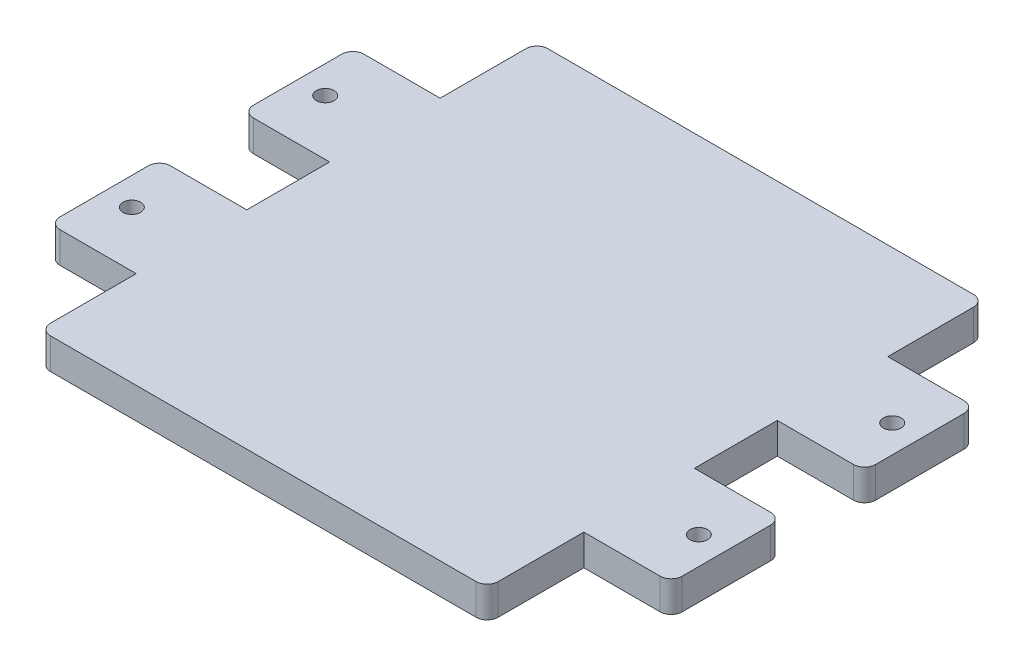
ISO-10303-21;
HEADER;
FILE_DESCRIPTION(('STEP AP214'),'2;1');
FILE_NAME('part.step','',(''),(''),'','','');
FILE_SCHEMA(('AUTOMOTIVE_DESIGN { 1 0 10303 214 1 1 1 1 }'));
ENDSEC;
DATA;
#1=APPLICATION_CONTEXT('core data for automotive mechanical design processes');
#2=APPLICATION_PROTOCOL_DEFINITION('international standard','automotive_design',2000,#1);
#3=PRODUCT_CONTEXT('',#1,'mechanical');
#4=PRODUCT('Part','Part','',(#3));
#5=PRODUCT_RELATED_PRODUCT_CATEGORY('part','',(#4));
#6=PRODUCT_DEFINITION_FORMATION('','',#4);
#7=PRODUCT_DEFINITION_CONTEXT('part definition',#1,'design');
#8=PRODUCT_DEFINITION('design','',#6,#7);
#9=PRODUCT_DEFINITION_SHAPE('','',#8);
#10=(LENGTH_UNIT() NAMED_UNIT(*) SI_UNIT(.MILLI.,.METRE.));
#11=(NAMED_UNIT(*) PLANE_ANGLE_UNIT() SI_UNIT($,.RADIAN.));
#12=(NAMED_UNIT(*) SI_UNIT($,.STERADIAN.) SOLID_ANGLE_UNIT());
#13=UNCERTAINTY_MEASURE_WITH_UNIT(LENGTH_MEASURE(1.E-05),#10,'distance_accuracy_value','');
#14=(GEOMETRIC_REPRESENTATION_CONTEXT(3) GLOBAL_UNCERTAINTY_ASSIGNED_CONTEXT((#13)) GLOBAL_UNIT_ASSIGNED_CONTEXT((#10,
#11,#12)) REPRESENTATION_CONTEXT('',''));
#15=CARTESIAN_POINT('',(0.,0.,0.));
#16=DIRECTION('',(0.,0.,1.));
#17=DIRECTION('',(1.,0.,0.));
#18=AXIS2_PLACEMENT_3D('',#15,#16,#17);
#19=CARTESIAN_POINT('',(40.5,5.6,-45.));
#20=DIRECTION('',(-1.,0.,0.));
#21=DIRECTION('',(0.,0.,1.));
#22=AXIS2_PLACEMENT_3D('',#19,#20,#21);
#23=PLANE('',#22);
#24=DIRECTION('',(0.,0.,-1.));
#25=VECTOR('',#24,1.);
#26=CARTESIAN_POINT('',(40.5,5.6,-45.));
#27=LINE('',#26,#25);
#28=CARTESIAN_POINT('',(40.5,5.6,43.));
#29=VERTEX_POINT('',#28);
#30=CARTESIAN_POINT('',(40.5,5.6,27.4999999999999));
#31=VERTEX_POINT('',#30);
#32=EDGE_CURVE('E362',#29,#31,#27,.T.);
#33=ORIENTED_EDGE('',*,*,#32,.F.);
#34=DIRECTION('',(0.,-1.,0.));
#35=VECTOR('',#34,1.);
#36=CARTESIAN_POINT('',(40.5,5.6,43.));
#37=LINE('',#36,#35);
#38=CARTESIAN_POINT('',(40.5,0.,43.));
#39=VERTEX_POINT('',#38);
#40=EDGE_CURVE('E430',#29,#39,#37,.T.);
#41=ORIENTED_EDGE('',*,*,#40,.T.);
#42=DIRECTION('',(0.,0.,-1.));
#43=VECTOR('',#42,1.);
#44=CARTESIAN_POINT('',(40.5,0.,-45.));
#45=LINE('',#44,#43);
#46=CARTESIAN_POINT('',(40.5,0.,27.4999999999999));
#47=VERTEX_POINT('',#46);
#48=EDGE_CURVE('E268',#39,#47,#45,.T.);
#49=ORIENTED_EDGE('',*,*,#48,.T.);
#50=DIRECTION('',(0.,1.,0.));
#51=VECTOR('',#50,1.);
#52=CARTESIAN_POINT('',(40.5,0.,27.5));
#53=LINE('',#52,#51);
#54=EDGE_CURVE('E274',#47,#31,#53,.T.);
#55=ORIENTED_EDGE('',*,*,#54,.T.);
#56=EDGE_LOOP('',(#33,#41,#49,#55));
#57=FACE_BOUND('',#56,.T.);
#58=ADVANCED_FACE('F37',(#57),#23,.F.);
#59=CARTESIAN_POINT('',(-40.5,5.6,-45.));
#60=DIRECTION('',(1.,0.,0.));
#61=DIRECTION('',(0.,0.,-1.));
#62=AXIS2_PLACEMENT_3D('',#59,#60,#61);
#63=PLANE('',#62);
#64=DIRECTION('',(0.,0.,1.));
#65=VECTOR('',#64,1.);
#66=CARTESIAN_POINT('',(-40.5,0.,-45.));
#67=LINE('',#66,#65);
#68=CARTESIAN_POINT('',(-40.5,0.,27.5));
#69=VERTEX_POINT('',#68);
#70=CARTESIAN_POINT('',(-40.5,0.,43.));
#71=VERTEX_POINT('',#70);
#72=EDGE_CURVE('E451',#69,#71,#67,.T.);
#73=ORIENTED_EDGE('',*,*,#72,.T.);
#74=DIRECTION('',(0.,-1.,0.));
#75=VECTOR('',#74,1.);
#76=CARTESIAN_POINT('',(-40.5,5.6,43.));
#77=LINE('',#76,#75);
#78=CARTESIAN_POINT('',(-40.5,5.6,43.));
#79=VERTEX_POINT('',#78);
#80=EDGE_CURVE('E12',#71,#79,#77,.F.);
#81=ORIENTED_EDGE('',*,*,#80,.T.);
#82=DIRECTION('',(0.,0.,1.));
#83=VECTOR('',#82,1.);
#84=CARTESIAN_POINT('',(-40.5,5.6,-45.));
#85=LINE('',#84,#83);
#86=CARTESIAN_POINT('',(-40.5,5.6,27.5));
#87=VERTEX_POINT('',#86);
#88=EDGE_CURVE('E557',#87,#79,#85,.T.);
#89=ORIENTED_EDGE('',*,*,#88,.F.);
#90=DIRECTION('',(0.,1.,0.));
#91=VECTOR('',#90,1.);
#92=CARTESIAN_POINT('',(-40.5,0.,27.5));
#93=LINE('',#92,#91);
#94=EDGE_CURVE('E301',#69,#87,#93,.T.);
#95=ORIENTED_EDGE('',*,*,#94,.F.);
#96=EDGE_LOOP('',(#73,#81,#89,#95));
#97=FACE_BOUND('',#96,.T.);
#98=ADVANCED_FACE('F556',(#97),#63,.F.);
#99=CARTESIAN_POINT('',(-40.5,0.,-7.49999999999999));
#100=VERTEX_POINT('',#99);
#101=CARTESIAN_POINT('',(-40.5,0.,7.49999999999999));
#102=VERTEX_POINT('',#101);
#103=EDGE_CURVE('E449',#100,#102,#67,.T.);
#104=ORIENTED_EDGE('',*,*,#103,.T.);
#105=DIRECTION('',(0.,1.,0.));
#106=VECTOR('',#105,1.);
#107=CARTESIAN_POINT('',(-40.5,0.,7.50000000000001));
#108=LINE('',#107,#106);
#109=CARTESIAN_POINT('',(-40.5,5.6,7.49999999999999));
#110=VERTEX_POINT('',#109);
#111=EDGE_CURVE('E511',#102,#110,#108,.T.);
#112=ORIENTED_EDGE('',*,*,#111,.T.);
#113=CARTESIAN_POINT('',(-40.5,5.6,-7.49999999999999));
#114=VERTEX_POINT('',#113);
#115=EDGE_CURVE('E558',#114,#110,#85,.T.);
#116=ORIENTED_EDGE('',*,*,#115,.F.);
#117=DIRECTION('',(0.,1.,0.));
#118=VECTOR('',#117,1.);
#119=CARTESIAN_POINT('',(-40.5,0.,-7.49999999999999));
#120=LINE('',#119,#118);
#121=EDGE_CURVE('E312',#100,#114,#120,.T.);
#122=ORIENTED_EDGE('',*,*,#121,.F.);
#123=EDGE_LOOP('',(#104,#112,#116,#122));
#124=FACE_BOUND('',#123,.T.);
#125=ADVANCED_FACE('F509',(#124),#63,.F.);
#126=CARTESIAN_POINT('',(40.5,0.,-27.5));
#127=VERTEX_POINT('',#126);
#128=CARTESIAN_POINT('',(40.5,0.,-43.));
#129=VERTEX_POINT('',#128);
#130=EDGE_CURVE('E269',#127,#129,#45,.T.);
#131=ORIENTED_EDGE('',*,*,#130,.T.);
#132=DIRECTION('',(0.,-1.,0.));
#133=VECTOR('',#132,1.);
#134=CARTESIAN_POINT('',(40.5,5.6,-43.));
#135=LINE('',#134,#133);
#136=CARTESIAN_POINT('',(40.5,5.6,-43.));
#137=VERTEX_POINT('',#136);
#138=EDGE_CURVE('E388',#129,#137,#135,.F.);
#139=ORIENTED_EDGE('',*,*,#138,.T.);
#140=CARTESIAN_POINT('',(40.5,5.6,-27.5));
#141=VERTEX_POINT('',#140);
#142=EDGE_CURVE('E367',#141,#137,#27,.T.);
#143=ORIENTED_EDGE('',*,*,#142,.F.);
#144=DIRECTION('',(0.,1.,0.));
#145=VECTOR('',#144,1.);
#146=CARTESIAN_POINT('',(40.5,0.,-27.5));
#147=LINE('',#146,#145);
#148=EDGE_CURVE('E786',#127,#141,#147,.T.);
#149=ORIENTED_EDGE('',*,*,#148,.F.);
#150=EDGE_LOOP('',(#131,#139,#143,#149));
#151=FACE_BOUND('',#150,.T.);
#152=ADVANCED_FACE('F650',(#151),#23,.F.);
#153=CARTESIAN_POINT('',(40.5,5.6,7.49999999999997));
#154=VERTEX_POINT('',#153);
#155=CARTESIAN_POINT('',(40.5,5.6,-7.50000000000001));
#156=VERTEX_POINT('',#155);
#157=EDGE_CURVE('E273',#154,#156,#27,.T.);
#158=ORIENTED_EDGE('',*,*,#157,.F.);
#159=DIRECTION('',(0.,1.,0.));
#160=VECTOR('',#159,1.);
#161=CARTESIAN_POINT('',(40.5,0.,7.5));
#162=LINE('',#161,#160);
#163=CARTESIAN_POINT('',(40.5,0.,7.5));
#164=VERTEX_POINT('',#163);
#165=EDGE_CURVE('E251',#164,#154,#162,.T.);
#166=ORIENTED_EDGE('',*,*,#165,.F.);
#167=CARTESIAN_POINT('',(40.5,0.,-7.5));
#168=VERTEX_POINT('',#167);
#169=EDGE_CURVE('E259',#164,#168,#45,.T.);
#170=ORIENTED_EDGE('',*,*,#169,.T.);
#171=DIRECTION('',(0.,1.,0.));
#172=VECTOR('',#171,1.);
#173=CARTESIAN_POINT('',(40.5,0.,-7.5));
#174=LINE('',#173,#172);
#175=EDGE_CURVE('E368',#168,#156,#174,.T.);
#176=ORIENTED_EDGE('',*,*,#175,.T.);
#177=EDGE_LOOP('',(#158,#166,#170,#176));
#178=FACE_BOUND('',#177,.T.);
#179=ADVANCED_FACE('F272',(#178),#23,.F.);
#180=CARTESIAN_POINT('',(-40.5,5.6,-45.));
#181=DIRECTION('',(0.,0.,1.));
#182=DIRECTION('',(1.,0.,0.));
#183=AXIS2_PLACEMENT_3D('',#180,#181,#182);
#184=PLANE('',#183);
#185=DIRECTION('',(-1.,0.,0.));
#186=VECTOR('',#185,1.);
#187=CARTESIAN_POINT('',(-40.5,0.,-45.));
#188=LINE('',#187,#186);
#189=CARTESIAN_POINT('',(38.5,0.,-45.));
#190=VERTEX_POINT('',#189);
#191=CARTESIAN_POINT('',(-38.5,0.,-45.));
#192=VERTEX_POINT('',#191);
#193=EDGE_CURVE('E497',#190,#192,#188,.T.);
#194=ORIENTED_EDGE('',*,*,#193,.T.);
#195=DIRECTION('',(0.,-1.,0.));
#196=VECTOR('',#195,1.);
#197=CARTESIAN_POINT('',(-38.5,5.6,-45.));
#198=LINE('',#197,#196);
#199=CARTESIAN_POINT('',(-38.5,5.6,-45.));
#200=VERTEX_POINT('',#199);
#201=EDGE_CURVE('E482',#192,#200,#198,.F.);
#202=ORIENTED_EDGE('',*,*,#201,.T.);
#203=DIRECTION('',(-1.,0.,0.));
#204=VECTOR('',#203,1.);
#205=CARTESIAN_POINT('',(-40.5,5.6,-45.));
#206=LINE('',#205,#204);
#207=CARTESIAN_POINT('',(38.5,5.6,-45.));
#208=VERTEX_POINT('',#207);
#209=EDGE_CURVE('E366',#208,#200,#206,.T.);
#210=ORIENTED_EDGE('',*,*,#209,.F.);
#211=DIRECTION('',(0.,-1.,0.));
#212=VECTOR('',#211,1.);
#213=CARTESIAN_POINT('',(38.5,5.6,-45.));
#214=LINE('',#213,#212);
#215=EDGE_CURVE('E479',#208,#190,#214,.T.);
#216=ORIENTED_EDGE('',*,*,#215,.T.);
#217=EDGE_LOOP('',(#194,#202,#210,#216));
#218=FACE_BOUND('',#217,.T.);
#219=ADVANCED_FACE('F660',(#218),#184,.F.);
#220=CARTESIAN_POINT('',(-40.5,5.6,-43.));
#221=VERTEX_POINT('',#220);
#222=CARTESIAN_POINT('',(-40.5,5.6,-27.5));
#223=VERTEX_POINT('',#222);
#224=EDGE_CURVE('E495',#221,#223,#85,.T.);
#225=ORIENTED_EDGE('',*,*,#224,.F.);
#226=DIRECTION('',(0.,-1.,0.));
#227=VECTOR('',#226,1.);
#228=CARTESIAN_POINT('',(-40.5,5.6,-43.));
#229=LINE('',#228,#227);
#230=CARTESIAN_POINT('',(-40.5,0.,-43.));
#231=VERTEX_POINT('',#230);
#232=EDGE_CURVE('E454',#221,#231,#229,.T.);
#233=ORIENTED_EDGE('',*,*,#232,.T.);
#234=CARTESIAN_POINT('',(-40.5,0.,-27.5));
#235=VERTEX_POINT('',#234);
#236=EDGE_CURVE('E446',#231,#235,#67,.T.);
#237=ORIENTED_EDGE('',*,*,#236,.T.);
#238=DIRECTION('',(0.,1.,0.));
#239=VECTOR('',#238,1.);
#240=CARTESIAN_POINT('',(-40.5,0.,-27.5));
#241=LINE('',#240,#239);
#242=EDGE_CURVE('E571',#235,#223,#241,.T.);
#243=ORIENTED_EDGE('',*,*,#242,.T.);
#244=EDGE_LOOP('',(#225,#233,#237,#243));
#245=FACE_BOUND('',#244,.T.);
#246=ADVANCED_FACE('F574',(#245),#63,.F.);
#247=CARTESIAN_POINT('',(-40.5,5.6,45.));
#248=DIRECTION('',(0.,0.,-1.));
#249=DIRECTION('',(-1.,0.,0.));
#250=AXIS2_PLACEMENT_3D('',#247,#248,#249);
#251=PLANE('',#250);
#252=DIRECTION('',(1.,0.,0.));
#253=VECTOR('',#252,1.);
#254=CARTESIAN_POINT('',(-40.5,0.,45.));
#255=LINE('',#254,#253);
#256=CARTESIAN_POINT('',(-38.5,0.,45.));
#257=VERTEX_POINT('',#256);
#258=CARTESIAN_POINT('',(38.5,0.,45.));
#259=VERTEX_POINT('',#258);
#260=EDGE_CURVE('E438',#257,#259,#255,.T.);
#261=ORIENTED_EDGE('',*,*,#260,.T.);
#262=DIRECTION('',(0.,-1.,0.));
#263=VECTOR('',#262,1.);
#264=CARTESIAN_POINT('',(38.5,5.6,45.));
#265=LINE('',#264,#263);
#266=CARTESIAN_POINT('',(38.5,5.6,45.));
#267=VERTEX_POINT('',#266);
#268=EDGE_CURVE('E45',#259,#267,#265,.F.);
#269=ORIENTED_EDGE('',*,*,#268,.T.);
#270=DIRECTION('',(1.,0.,0.));
#271=VECTOR('',#270,1.);
#272=CARTESIAN_POINT('',(-40.5,5.6,45.));
#273=LINE('',#272,#271);
#274=CARTESIAN_POINT('',(-38.5,5.6,45.));
#275=VERTEX_POINT('',#274);
#276=EDGE_CURVE('E439',#275,#267,#273,.T.);
#277=ORIENTED_EDGE('',*,*,#276,.F.);
#278=DIRECTION('',(0.,-1.,0.));
#279=VECTOR('',#278,1.);
#280=CARTESIAN_POINT('',(-38.5,5.6,45.));
#281=LINE('',#280,#279);
#282=EDGE_CURVE('E433',#275,#257,#281,.T.);
#283=ORIENTED_EDGE('',*,*,#282,.T.);
#284=EDGE_LOOP('',(#261,#269,#277,#283));
#285=FACE_BOUND('',#284,.T.);
#286=ADVANCED_FACE('F437',(#285),#251,.F.);
#287=CARTESIAN_POINT('',(0.,5.6,0.));
#288=DIRECTION('',(0.,1.,0.));
#289=DIRECTION('',(0.,0.,1.));
#290=AXIS2_PLACEMENT_3D('',#287,#288,#289);
#291=PLANE('',#290);
#292=ORIENTED_EDGE('',*,*,#209,.T.);
#293=CARTESIAN_POINT('',(-38.5,5.6,-43.));
#294=DIRECTION('',(0.,1.,0.));
#295=DIRECTION('',(0.,0.,1.));
#296=AXIS2_PLACEMENT_3D('',#293,#294,#295);
#297=CIRCLE('',#296,2.);
#298=EDGE_CURVE('E383',#200,#221,#297,.T.);
#299=ORIENTED_EDGE('',*,*,#298,.T.);
#300=ORIENTED_EDGE('',*,*,#224,.T.);
#301=DIRECTION('',(-1.,0.,0.));
#302=VECTOR('',#301,1.);
#303=CARTESIAN_POINT('',(-40.5,5.6,-27.5));
#304=LINE('',#303,#302);
#305=CARTESIAN_POINT('',(-54.3,5.6,-27.5));
#306=VERTEX_POINT('',#305);
#307=EDGE_CURVE('E313',#223,#306,#304,.T.);
#308=ORIENTED_EDGE('',*,*,#307,.T.);
#309=CARTESIAN_POINT('',(-54.3,5.6,-25.5));
#310=DIRECTION('',(0.,1.,0.));
#311=DIRECTION('',(0.,0.,1.));
#312=AXIS2_PLACEMENT_3D('',#309,#310,#311);
#313=CIRCLE('',#312,2.);
#314=CARTESIAN_POINT('',(-56.3,5.6,-25.5));
#315=VERTEX_POINT('',#314);
#316=EDGE_CURVE('E328',#306,#315,#313,.T.);
#317=ORIENTED_EDGE('',*,*,#316,.T.);
#318=DIRECTION('',(0.,0.,1.));
#319=VECTOR('',#318,1.);
#320=CARTESIAN_POINT('',(-56.3,5.6,-27.5));
#321=LINE('',#320,#319);
#322=CARTESIAN_POINT('',(-56.3,5.6,-9.49999999999998));
#323=VERTEX_POINT('',#322);
#324=EDGE_CURVE('E317',#315,#323,#321,.T.);
#325=ORIENTED_EDGE('',*,*,#324,.T.);
#326=CARTESIAN_POINT('',(-54.3,5.6,-9.49999999999999));
#327=DIRECTION('',(0.,1.,0.));
#328=DIRECTION('',(0.,0.,1.));
#329=AXIS2_PLACEMENT_3D('',#326,#327,#328);
#330=CIRCLE('',#329,2.);
#331=CARTESIAN_POINT('',(-54.3,5.6,-7.49999999999999));
#332=VERTEX_POINT('',#331);
#333=EDGE_CURVE('E333',#323,#332,#330,.T.);
#334=ORIENTED_EDGE('',*,*,#333,.T.);
#335=DIRECTION('',(1.,0.,0.));
#336=VECTOR('',#335,1.);
#337=CARTESIAN_POINT('',(-40.5,5.6,-7.49999999999999));
#338=LINE('',#337,#336);
#339=EDGE_CURVE('E307',#332,#114,#338,.T.);
#340=ORIENTED_EDGE('',*,*,#339,.T.);
#341=ORIENTED_EDGE('',*,*,#115,.T.);
#342=DIRECTION('',(-1.,0.,0.));
#343=VECTOR('',#342,1.);
#344=CARTESIAN_POINT('',(-40.5,5.6,7.50000000000001));
#345=LINE('',#344,#343);
#346=CARTESIAN_POINT('',(-54.3,5.6,7.49999999999999));
#347=VERTEX_POINT('',#346);
#348=EDGE_CURVE('E284',#110,#347,#345,.T.);
#349=ORIENTED_EDGE('',*,*,#348,.T.);
#350=CARTESIAN_POINT('',(-54.3,5.6,9.49999999999999));
#351=DIRECTION('',(0.,1.,0.));
#352=DIRECTION('',(0.,0.,1.));
#353=AXIS2_PLACEMENT_3D('',#350,#351,#352);
#354=CIRCLE('',#353,2.);
#355=CARTESIAN_POINT('',(-56.3,5.6,9.49999999999998));
#356=VERTEX_POINT('',#355);
#357=EDGE_CURVE('E543',#347,#356,#354,.T.);
#358=ORIENTED_EDGE('',*,*,#357,.T.);
#359=DIRECTION('',(0.,0.,1.));
#360=VECTOR('',#359,1.);
#361=CARTESIAN_POINT('',(-56.3,5.6,27.5));
#362=LINE('',#361,#360);
#363=CARTESIAN_POINT('',(-56.3,5.6,25.5));
#364=VERTEX_POINT('',#363);
#365=EDGE_CURVE('E528',#356,#364,#362,.T.);
#366=ORIENTED_EDGE('',*,*,#365,.T.);
#367=CARTESIAN_POINT('',(-54.3,5.6,25.5));
#368=DIRECTION('',(0.,1.,0.));
#369=DIRECTION('',(0.,0.,1.));
#370=AXIS2_PLACEMENT_3D('',#367,#368,#369);
#371=CIRCLE('',#370,2.);
#372=CARTESIAN_POINT('',(-54.3,5.6,27.5));
#373=VERTEX_POINT('',#372);
#374=EDGE_CURVE('E541',#364,#373,#371,.T.);
#375=ORIENTED_EDGE('',*,*,#374,.T.);
#376=DIRECTION('',(1.,0.,0.));
#377=VECTOR('',#376,1.);
#378=CARTESIAN_POINT('',(-40.5,5.6,27.5));
#379=LINE('',#378,#377);
#380=EDGE_CURVE('E526',#373,#87,#379,.T.);
#381=ORIENTED_EDGE('',*,*,#380,.T.);
#382=ORIENTED_EDGE('',*,*,#88,.T.);
#383=CARTESIAN_POINT('',(-38.5,5.6,43.));
#384=DIRECTION('',(0.,1.,0.));
#385=DIRECTION('',(0.,0.,1.));
#386=AXIS2_PLACEMENT_3D('',#383,#384,#385);
#387=CIRCLE('',#386,2.);
#388=EDGE_CURVE('E58',#79,#275,#387,.T.);
#389=ORIENTED_EDGE('',*,*,#388,.T.);
#390=ORIENTED_EDGE('',*,*,#276,.T.);
#391=CARTESIAN_POINT('',(38.5,5.6,43.));
#392=DIRECTION('',(0.,1.,0.));
#393=DIRECTION('',(0.,0.,1.));
#394=AXIS2_PLACEMENT_3D('',#391,#392,#393);
#395=CIRCLE('',#394,2.);
#396=EDGE_CURVE('E486',#267,#29,#395,.T.);
#397=ORIENTED_EDGE('',*,*,#396,.T.);
#398=ORIENTED_EDGE('',*,*,#32,.T.);
#399=DIRECTION('',(1.,0.,0.));
#400=VECTOR('',#399,1.);
#401=CARTESIAN_POINT('',(40.5,5.6,27.5));
#402=LINE('',#401,#400);
#403=CARTESIAN_POINT('',(54.3,5.6,27.5));
#404=VERTEX_POINT('',#403);
#405=EDGE_CURVE('E353',#31,#404,#402,.T.);
#406=ORIENTED_EDGE('',*,*,#405,.T.);
#407=CARTESIAN_POINT('',(54.3,5.6,25.5));
#408=DIRECTION('',(0.,1.,0.));
#409=DIRECTION('',(0.,0.,1.));
#410=AXIS2_PLACEMENT_3D('',#407,#408,#409);
#411=CIRCLE('',#410,2.);
#412=CARTESIAN_POINT('',(56.3,5.6,25.5));
#413=VERTEX_POINT('',#412);
#414=EDGE_CURVE('E332',#404,#413,#411,.T.);
#415=ORIENTED_EDGE('',*,*,#414,.T.);
#416=DIRECTION('',(0.,0.,-1.));
#417=VECTOR('',#416,1.);
#418=CARTESIAN_POINT('',(56.3,5.6,27.5));
#419=LINE('',#418,#417);
#420=CARTESIAN_POINT('',(56.3,5.6,9.49999999999997));
#421=VERTEX_POINT('',#420);
#422=EDGE_CURVE('E349',#413,#421,#419,.T.);
#423=ORIENTED_EDGE('',*,*,#422,.T.);
#424=CARTESIAN_POINT('',(54.3,5.6,9.49999999999997));
#425=DIRECTION('',(0.,1.,0.));
#426=DIRECTION('',(0.,0.,1.));
#427=AXIS2_PLACEMENT_3D('',#424,#425,#426);
#428=CIRCLE('',#427,2.);
#429=CARTESIAN_POINT('',(54.3,5.6,7.49999999999998));
#430=VERTEX_POINT('',#429);
#431=EDGE_CURVE('E338',#421,#430,#428,.T.);
#432=ORIENTED_EDGE('',*,*,#431,.T.);
#433=DIRECTION('',(-1.,0.,0.));
#434=VECTOR('',#433,1.);
#435=CARTESIAN_POINT('',(40.5,5.6,7.5));
#436=LINE('',#435,#434);
#437=EDGE_CURVE('E352',#430,#154,#436,.T.);
#438=ORIENTED_EDGE('',*,*,#437,.T.);
#439=ORIENTED_EDGE('',*,*,#157,.T.);
#440=DIRECTION('',(1.,0.,0.));
#441=VECTOR('',#440,1.);
#442=CARTESIAN_POINT('',(40.5,5.6,-7.5));
#443=LINE('',#442,#441);
#444=CARTESIAN_POINT('',(54.3,5.6,-7.5));
#445=VERTEX_POINT('',#444);
#446=EDGE_CURVE('E583',#156,#445,#443,.T.);
#447=ORIENTED_EDGE('',*,*,#446,.T.);
#448=CARTESIAN_POINT('',(54.3,5.6,-9.5));
#449=DIRECTION('',(0.,1.,0.));
#450=DIRECTION('',(0.,0.,1.));
#451=AXIS2_PLACEMENT_3D('',#448,#449,#450);
#452=CIRCLE('',#451,2.);
#453=CARTESIAN_POINT('',(56.3,5.6,-9.5));
#454=VERTEX_POINT('',#453);
#455=EDGE_CURVE('E600',#445,#454,#452,.T.);
#456=ORIENTED_EDGE('',*,*,#455,.T.);
#457=DIRECTION('',(0.,0.,-1.));
#458=VECTOR('',#457,1.);
#459=CARTESIAN_POINT('',(56.3,5.6,-27.5));
#460=LINE('',#459,#458);
#461=CARTESIAN_POINT('',(56.3,5.6,-25.5));
#462=VERTEX_POINT('',#461);
#463=EDGE_CURVE('E595',#454,#462,#460,.T.);
#464=ORIENTED_EDGE('',*,*,#463,.T.);
#465=CARTESIAN_POINT('',(54.3,5.6,-25.5));
#466=DIRECTION('',(0.,1.,0.));
#467=DIRECTION('',(0.,0.,1.));
#468=AXIS2_PLACEMENT_3D('',#465,#466,#467);
#469=CIRCLE('',#468,2.);
#470=CARTESIAN_POINT('',(54.3,5.6,-27.5));
#471=VERTEX_POINT('',#470);
#472=EDGE_CURVE('E384',#462,#471,#469,.T.);
#473=ORIENTED_EDGE('',*,*,#472,.T.);
#474=DIRECTION('',(-1.,0.,0.));
#475=VECTOR('',#474,1.);
#476=CARTESIAN_POINT('',(40.5,5.6,-27.5));
#477=LINE('',#476,#475);
#478=EDGE_CURVE('E588',#471,#141,#477,.T.);
#479=ORIENTED_EDGE('',*,*,#478,.T.);
#480=ORIENTED_EDGE('',*,*,#142,.T.);
#481=CARTESIAN_POINT('',(38.5,5.6,-43.));
#482=DIRECTION('',(0.,1.,0.));
#483=DIRECTION('',(0.,0.,1.));
#484=AXIS2_PLACEMENT_3D('',#481,#482,#483);
#485=CIRCLE('',#484,2.);
#486=EDGE_CURVE('E379',#137,#208,#485,.T.);
#487=ORIENTED_EDGE('',*,*,#486,.T.);
#488=EDGE_LOOP('',(#292,#299,#300,#308,#317,#325,#334,#340,#341,#349,#358,#366,#375,#381,#382,
#389,#390,#397,#398,#406,#415,#423,#432,#438,#439,#447,#456,#464,#473,#479,#480,#487));
#489=FACE_BOUND('',#488,.T.);
#490=CARTESIAN_POINT('',(51.3,5.6,-17.5));
#491=DIRECTION('',(0.,1.,0.));
#492=DIRECTION('',(0.,0.,-1.));
#493=AXIS2_PLACEMENT_3D('',#490,#491,#492);
#494=CIRCLE('',#493,1.6);
#495=CARTESIAN_POINT('',(51.3,5.6,-19.1));
#496=VERTEX_POINT('',#495);
#497=EDGE_CURVE('E575',#496,#496,#494,.T.);
#498=ORIENTED_EDGE('',*,*,#497,.F.);
#499=EDGE_LOOP('',(#498));
#500=FACE_BOUND('',#499,.T.);
#501=CARTESIAN_POINT('',(-51.3,5.6,-17.5));
#502=DIRECTION('',(0.,1.,0.));
#503=DIRECTION('',(0.,0.,1.));
#504=AXIS2_PLACEMENT_3D('',#501,#502,#503);
#505=CIRCLE('',#504,1.6);
#506=CARTESIAN_POINT('',(-51.3,5.6,-15.9));
#507=VERTEX_POINT('',#506);
#508=EDGE_CURVE('E295',#507,#507,#505,.T.);
#509=ORIENTED_EDGE('',*,*,#508,.F.);
#510=EDGE_LOOP('',(#509));
#511=FACE_BOUND('',#510,.T.);
#512=CARTESIAN_POINT('',(-51.3,5.6,17.5));
#513=DIRECTION('',(0.,1.,0.));
#514=DIRECTION('',(0.,0.,-1.));
#515=AXIS2_PLACEMENT_3D('',#512,#513,#514);
#516=CIRCLE('',#515,1.6);
#517=CARTESIAN_POINT('',(-51.3,5.6,15.9));
#518=VERTEX_POINT('',#517);
#519=EDGE_CURVE('E277',#518,#518,#516,.T.);
#520=ORIENTED_EDGE('',*,*,#519,.F.);
#521=EDGE_LOOP('',(#520));
#522=FACE_BOUND('',#521,.T.);
#523=CARTESIAN_POINT('',(51.3,5.6,17.5));
#524=DIRECTION('',(0.,1.,0.));
#525=DIRECTION('',(0.,0.,1.));
#526=AXIS2_PLACEMENT_3D('',#523,#524,#525);
#527=CIRCLE('',#526,1.6);
#528=CARTESIAN_POINT('',(51.3,5.6,19.1));
#529=VERTEX_POINT('',#528);
#530=EDGE_CURVE('E616',#529,#529,#527,.T.);
#531=ORIENTED_EDGE('',*,*,#530,.F.);
#532=EDGE_LOOP('',(#531));
#533=FACE_BOUND('',#532,.T.);
#534=ADVANCED_FACE('F562',(#489,#500,#511,#522,#533),#291,.T.);
#535=CARTESIAN_POINT('',(0.,0.,0.));
#536=DIRECTION('',(0.,1.,0.));
#537=DIRECTION('',(0.,0.,1.));
#538=AXIS2_PLACEMENT_3D('',#535,#536,#537);
#539=PLANE('',#538);
#540=ORIENTED_EDGE('',*,*,#236,.F.);
#541=CARTESIAN_POINT('',(-38.5,0.,-43.));
#542=DIRECTION('',(0.,1.,0.));
#543=DIRECTION('',(0.,0.,1.));
#544=AXIS2_PLACEMENT_3D('',#541,#542,#543);
#545=CIRCLE('',#544,2.);
#546=EDGE_CURVE('E477',#231,#192,#545,.F.);
#547=ORIENTED_EDGE('',*,*,#546,.T.);
#548=ORIENTED_EDGE('',*,*,#193,.F.);
#549=CARTESIAN_POINT('',(38.5,0.,-43.));
#550=DIRECTION('',(0.,1.,0.));
#551=DIRECTION('',(0.,0.,1.));
#552=AXIS2_PLACEMENT_3D('',#549,#550,#551);
#553=CIRCLE('',#552,2.);
#554=EDGE_CURVE('E475',#190,#129,#553,.F.);
#555=ORIENTED_EDGE('',*,*,#554,.T.);
#556=ORIENTED_EDGE('',*,*,#130,.F.);
#557=DIRECTION('',(-1.,0.,0.));
#558=VECTOR('',#557,1.);
#559=CARTESIAN_POINT('',(40.5,0.,-27.5));
#560=LINE('',#559,#558);
#561=CARTESIAN_POINT('',(54.3,0.,-27.5));
#562=VERTEX_POINT('',#561);
#563=EDGE_CURVE('E591',#562,#127,#560,.T.);
#564=ORIENTED_EDGE('',*,*,#563,.F.);
#565=CARTESIAN_POINT('',(54.3,0.,-25.5));
#566=DIRECTION('',(0.,1.,0.));
#567=DIRECTION('',(0.,0.,1.));
#568=AXIS2_PLACEMENT_3D('',#565,#566,#567);
#569=CIRCLE('',#568,2.);
#570=CARTESIAN_POINT('',(56.3,0.,-25.5));
#571=VERTEX_POINT('',#570);
#572=EDGE_CURVE('E473',#562,#571,#569,.F.);
#573=ORIENTED_EDGE('',*,*,#572,.T.);
#574=DIRECTION('',(0.,0.,-1.));
#575=VECTOR('',#574,1.);
#576=CARTESIAN_POINT('',(56.3,0.,-27.5));
#577=LINE('',#576,#575);
#578=CARTESIAN_POINT('',(56.3,0.,-9.5));
#579=VERTEX_POINT('',#578);
#580=EDGE_CURVE('E587',#579,#571,#577,.T.);
#581=ORIENTED_EDGE('',*,*,#580,.F.);
#582=CARTESIAN_POINT('',(54.3,0.,-9.5));
#583=DIRECTION('',(0.,1.,0.));
#584=DIRECTION('',(0.,0.,1.));
#585=AXIS2_PLACEMENT_3D('',#582,#583,#584);
#586=CIRCLE('',#585,2.);
#587=CARTESIAN_POINT('',(54.3,0.,-7.5));
#588=VERTEX_POINT('',#587);
#589=EDGE_CURVE('E471',#579,#588,#586,.F.);
#590=ORIENTED_EDGE('',*,*,#589,.T.);
#591=DIRECTION('',(1.,0.,0.));
#592=VECTOR('',#591,1.);
#593=CARTESIAN_POINT('',(40.5,0.,-7.5));
#594=LINE('',#593,#592);
#595=EDGE_CURVE('E264',#168,#588,#594,.T.);
#596=ORIENTED_EDGE('',*,*,#595,.F.);
#597=ORIENTED_EDGE('',*,*,#169,.F.);
#598=DIRECTION('',(-1.,0.,0.));
#599=VECTOR('',#598,1.);
#600=CARTESIAN_POINT('',(40.5,0.,7.5));
#601=LINE('',#600,#599);
#602=CARTESIAN_POINT('',(54.3,0.,7.49999999999998));
#603=VERTEX_POINT('',#602);
#604=EDGE_CURVE('E246',#603,#164,#601,.T.);
#605=ORIENTED_EDGE('',*,*,#604,.F.);
#606=CARTESIAN_POINT('',(54.3,0.,9.49999999999997));
#607=DIRECTION('',(0.,1.,0.));
#608=DIRECTION('',(0.,0.,1.));
#609=AXIS2_PLACEMENT_3D('',#606,#607,#608);
#610=CIRCLE('',#609,2.);
#611=CARTESIAN_POINT('',(56.3,0.,9.49999999999997));
#612=VERTEX_POINT('',#611);
#613=EDGE_CURVE('E469',#603,#612,#610,.F.);
#614=ORIENTED_EDGE('',*,*,#613,.T.);
#615=DIRECTION('',(0.,0.,-1.));
#616=VECTOR('',#615,1.);
#617=CARTESIAN_POINT('',(56.3,0.,27.5));
#618=LINE('',#617,#616);
#619=CARTESIAN_POINT('',(56.3,0.,25.5));
#620=VERTEX_POINT('',#619);
#621=EDGE_CURVE('E256',#620,#612,#618,.T.);
#622=ORIENTED_EDGE('',*,*,#621,.F.);
#623=CARTESIAN_POINT('',(54.3,0.,25.5));
#624=DIRECTION('',(0.,1.,0.));
#625=DIRECTION('',(0.,0.,1.));
#626=AXIS2_PLACEMENT_3D('',#623,#624,#625);
#627=CIRCLE('',#626,2.);
#628=CARTESIAN_POINT('',(54.3,0.,27.5));
#629=VERTEX_POINT('',#628);
#630=EDGE_CURVE('E467',#620,#629,#627,.F.);
#631=ORIENTED_EDGE('',*,*,#630,.T.);
#632=DIRECTION('',(1.,0.,0.));
#633=VECTOR('',#632,1.);
#634=CARTESIAN_POINT('',(40.5,0.,27.5));
#635=LINE('',#634,#633);
#636=EDGE_CURVE('E356',#47,#629,#635,.T.);
#637=ORIENTED_EDGE('',*,*,#636,.F.);
#638=ORIENTED_EDGE('',*,*,#48,.F.);
#639=CARTESIAN_POINT('',(38.5,0.,43.));
#640=DIRECTION('',(0.,1.,0.));
#641=DIRECTION('',(0.,0.,1.));
#642=AXIS2_PLACEMENT_3D('',#639,#640,#641);
#643=CIRCLE('',#642,2.);
#644=EDGE_CURVE('E445',#39,#259,#643,.F.);
#645=ORIENTED_EDGE('',*,*,#644,.T.);
#646=ORIENTED_EDGE('',*,*,#260,.F.);
#647=CARTESIAN_POINT('',(-38.5,0.,43.));
#648=DIRECTION('',(0.,1.,0.));
#649=DIRECTION('',(0.,0.,1.));
#650=AXIS2_PLACEMENT_3D('',#647,#648,#649);
#651=CIRCLE('',#650,2.);
#652=EDGE_CURVE('E442',#257,#71,#651,.F.);
#653=ORIENTED_EDGE('',*,*,#652,.T.);
#654=ORIENTED_EDGE('',*,*,#72,.F.);
#655=DIRECTION('',(1.,0.,0.));
#656=VECTOR('',#655,1.);
#657=CARTESIAN_POINT('',(-40.5,0.,27.5));
#658=LINE('',#657,#656);
#659=CARTESIAN_POINT('',(-54.3,0.,27.5));
#660=VERTEX_POINT('',#659);
#661=EDGE_CURVE('E522',#660,#69,#658,.T.);
#662=ORIENTED_EDGE('',*,*,#661,.F.);
#663=CARTESIAN_POINT('',(-54.3,0.,25.5));
#664=DIRECTION('',(0.,1.,0.));
#665=DIRECTION('',(0.,0.,1.));
#666=AXIS2_PLACEMENT_3D('',#663,#664,#665);
#667=CIRCLE('',#666,2.);
#668=CARTESIAN_POINT('',(-56.3,0.,25.5));
#669=VERTEX_POINT('',#668);
#670=EDGE_CURVE('E461',#660,#669,#667,.F.);
#671=ORIENTED_EDGE('',*,*,#670,.T.);
#672=DIRECTION('',(0.,0.,1.));
#673=VECTOR('',#672,1.);
#674=CARTESIAN_POINT('',(-56.3,0.,27.5));
#675=LINE('',#674,#673);
#676=CARTESIAN_POINT('',(-56.3,0.,9.49999999999998));
#677=VERTEX_POINT('',#676);
#678=EDGE_CURVE('E525',#677,#669,#675,.T.);
#679=ORIENTED_EDGE('',*,*,#678,.F.);
#680=CARTESIAN_POINT('',(-54.3,0.,9.49999999999999));
#681=DIRECTION('',(0.,1.,0.));
#682=DIRECTION('',(0.,0.,1.));
#683=AXIS2_PLACEMENT_3D('',#680,#681,#682);
#684=CIRCLE('',#683,2.);
#685=CARTESIAN_POINT('',(-54.3,0.,7.49999999999999));
#686=VERTEX_POINT('',#685);
#687=EDGE_CURVE('E459',#677,#686,#684,.F.);
#688=ORIENTED_EDGE('',*,*,#687,.T.);
#689=DIRECTION('',(-1.,0.,0.));
#690=VECTOR('',#689,1.);
#691=CARTESIAN_POINT('',(-40.5,0.,7.50000000000001));
#692=LINE('',#691,#690);
#693=EDGE_CURVE('E288',#102,#686,#692,.T.);
#694=ORIENTED_EDGE('',*,*,#693,.F.);
#695=ORIENTED_EDGE('',*,*,#103,.F.);
#696=DIRECTION('',(1.,0.,0.));
#697=VECTOR('',#696,1.);
#698=CARTESIAN_POINT('',(-40.5,0.,-7.49999999999999));
#699=LINE('',#698,#697);
#700=CARTESIAN_POINT('',(-54.3,0.,-7.49999999999999));
#701=VERTEX_POINT('',#700);
#702=EDGE_CURVE('E310',#701,#100,#699,.T.);
#703=ORIENTED_EDGE('',*,*,#702,.F.);
#704=CARTESIAN_POINT('',(-54.3,0.,-9.49999999999999));
#705=DIRECTION('',(0.,1.,0.));
#706=DIRECTION('',(0.,0.,1.));
#707=AXIS2_PLACEMENT_3D('',#704,#705,#706);
#708=CIRCLE('',#707,2.);
#709=CARTESIAN_POINT('',(-56.3,0.,-9.49999999999998));
#710=VERTEX_POINT('',#709);
#711=EDGE_CURVE('E463',#701,#710,#708,.F.);
#712=ORIENTED_EDGE('',*,*,#711,.T.);
#713=DIRECTION('',(0.,0.,1.));
#714=VECTOR('',#713,1.);
#715=CARTESIAN_POINT('',(-56.3,0.,-27.5));
#716=LINE('',#715,#714);
#717=CARTESIAN_POINT('',(-56.3,0.,-25.5));
#718=VERTEX_POINT('',#717);
#719=EDGE_CURVE('E306',#718,#710,#716,.T.);
#720=ORIENTED_EDGE('',*,*,#719,.F.);
#721=CARTESIAN_POINT('',(-54.3,0.,-25.5));
#722=DIRECTION('',(0.,1.,0.));
#723=DIRECTION('',(0.,0.,1.));
#724=AXIS2_PLACEMENT_3D('',#721,#722,#723);
#725=CIRCLE('',#724,2.);
#726=CARTESIAN_POINT('',(-54.3,0.,-27.5));
#727=VERTEX_POINT('',#726);
#728=EDGE_CURVE('E465',#718,#727,#725,.F.);
#729=ORIENTED_EDGE('',*,*,#728,.T.);
#730=DIRECTION('',(-1.,0.,0.));
#731=VECTOR('',#730,1.);
#732=CARTESIAN_POINT('',(-40.5,0.,-27.5));
#733=LINE('',#732,#731);
#734=EDGE_CURVE('E303',#235,#727,#733,.T.);
#735=ORIENTED_EDGE('',*,*,#734,.F.);
#736=EDGE_LOOP('',(#540,#547,#548,#555,#556,#564,#573,#581,#590,#596,#597,#605,#614,#622,#631,
#637,#638,#645,#646,#653,#654,#662,#671,#679,#688,#694,#695,#703,#712,#720,#729,#735));
#737=FACE_BOUND('',#736,.T.);
#738=CARTESIAN_POINT('',(51.3,0.,-17.5));
#739=DIRECTION('',(0.,1.,0.));
#740=DIRECTION('',(0.,0.,-1.));
#741=AXIS2_PLACEMENT_3D('',#738,#739,#740);
#742=CIRCLE('',#741,1.6);
#743=CARTESIAN_POINT('',(51.3,0.,-19.1));
#744=VERTEX_POINT('',#743);
#745=EDGE_CURVE('E578',#744,#744,#742,.T.);
#746=ORIENTED_EDGE('',*,*,#745,.T.);
#747=EDGE_LOOP('',(#746));
#748=FACE_BOUND('',#747,.T.);
#749=CARTESIAN_POINT('',(-51.3,0.,-17.5));
#750=DIRECTION('',(0.,1.,0.));
#751=DIRECTION('',(0.,0.,1.));
#752=AXIS2_PLACEMENT_3D('',#749,#750,#751);
#753=CIRCLE('',#752,1.6);
#754=CARTESIAN_POINT('',(-51.3,0.,-15.9));
#755=VERTEX_POINT('',#754);
#756=EDGE_CURVE('E300',#755,#755,#753,.T.);
#757=ORIENTED_EDGE('',*,*,#756,.T.);
#758=EDGE_LOOP('',(#757));
#759=FACE_BOUND('',#758,.T.);
#760=CARTESIAN_POINT('',(-51.3,0.,17.5));
#761=DIRECTION('',(0.,1.,0.));
#762=DIRECTION('',(0.,0.,-1.));
#763=AXIS2_PLACEMENT_3D('',#760,#761,#762);
#764=CIRCLE('',#763,1.6);
#765=CARTESIAN_POINT('',(-51.3,0.,15.9));
#766=VERTEX_POINT('',#765);
#767=EDGE_CURVE('E281',#766,#766,#764,.T.);
#768=ORIENTED_EDGE('',*,*,#767,.T.);
#769=EDGE_LOOP('',(#768));
#770=FACE_BOUND('',#769,.T.);
#771=CARTESIAN_POINT('',(51.3,0.,17.5));
#772=DIRECTION('',(0.,1.,0.));
#773=DIRECTION('',(0.,0.,1.));
#774=AXIS2_PLACEMENT_3D('',#771,#772,#773);
#775=CIRCLE('',#774,1.6);
#776=CARTESIAN_POINT('',(51.3,0.,19.1));
#777=VERTEX_POINT('',#776);
#778=EDGE_CURVE('E620',#777,#777,#775,.T.);
#779=ORIENTED_EDGE('',*,*,#778,.T.);
#780=EDGE_LOOP('',(#779));
#781=FACE_BOUND('',#780,.T.);
#782=ADVANCED_FACE('F261',(#737,#748,#759,#770,#781),#539,.F.);
#783=CARTESIAN_POINT('',(40.5,0.,-27.5));
#784=DIRECTION('',(0.,0.,-1.));
#785=DIRECTION('',(-1.,0.,0.));
#786=AXIS2_PLACEMENT_3D('',#783,#784,#785);
#787=PLANE('',#786);
#788=ORIENTED_EDGE('',*,*,#478,.F.);
#789=DIRECTION('',(0.,1.,0.));
#790=VECTOR('',#789,1.);
#791=CARTESIAN_POINT('',(54.3,0.,-27.5));
#792=LINE('',#791,#790);
#793=EDGE_CURVE('E396',#471,#562,#792,.F.);
#794=ORIENTED_EDGE('',*,*,#793,.T.);
#795=ORIENTED_EDGE('',*,*,#563,.T.);
#796=ORIENTED_EDGE('',*,*,#148,.T.);
#797=EDGE_LOOP('',(#788,#794,#795,#796));
#798=FACE_BOUND('',#797,.T.);
#799=ADVANCED_FACE('F672',(#798),#787,.T.);
#800=CARTESIAN_POINT('',(56.3,0.,-27.5));
#801=DIRECTION('',(1.,0.,0.));
#802=DIRECTION('',(0.,0.,-1.));
#803=AXIS2_PLACEMENT_3D('',#800,#801,#802);
#804=PLANE('',#803);
#805=ORIENTED_EDGE('',*,*,#580,.T.);
#806=DIRECTION('',(0.,1.,0.));
#807=VECTOR('',#806,1.);
#808=CARTESIAN_POINT('',(56.3,0.,-25.5));
#809=LINE('',#808,#807);
#810=EDGE_CURVE('E393',#571,#462,#809,.T.);
#811=ORIENTED_EDGE('',*,*,#810,.T.);
#812=ORIENTED_EDGE('',*,*,#463,.F.);
#813=DIRECTION('',(0.,1.,0.));
#814=VECTOR('',#813,1.);
#815=CARTESIAN_POINT('',(56.3,0.,-9.5));
#816=LINE('',#815,#814);
#817=EDGE_CURVE('E391',#454,#579,#816,.F.);
#818=ORIENTED_EDGE('',*,*,#817,.T.);
#819=EDGE_LOOP('',(#805,#811,#812,#818));
#820=FACE_BOUND('',#819,.T.);
#821=ADVANCED_FACE('F679',(#820),#804,.T.);
#822=CARTESIAN_POINT('',(40.5,0.,-7.5));
#823=DIRECTION('',(0.,0.,1.));
#824=DIRECTION('',(1.,0.,0.));
#825=AXIS2_PLACEMENT_3D('',#822,#823,#824);
#826=PLANE('',#825);
#827=ORIENTED_EDGE('',*,*,#595,.T.);
#828=DIRECTION('',(0.,1.,0.));
#829=VECTOR('',#828,1.);
#830=CARTESIAN_POINT('',(54.3,0.,-7.5));
#831=LINE('',#830,#829);
#832=EDGE_CURVE('E398',#588,#445,#831,.T.);
#833=ORIENTED_EDGE('',*,*,#832,.T.);
#834=ORIENTED_EDGE('',*,*,#446,.F.);
#835=ORIENTED_EDGE('',*,*,#175,.F.);
#836=EDGE_LOOP('',(#827,#833,#834,#835));
#837=FACE_BOUND('',#836,.T.);
#838=ADVANCED_FACE('F675',(#837),#826,.T.);
#839=CARTESIAN_POINT('',(51.3,0.,-17.5));
#840=DIRECTION('',(0.,1.,0.));
#841=DIRECTION('',(0.,0.,1.));
#842=AXIS2_PLACEMENT_3D('',#839,#840,#841);
#843=CYLINDRICAL_SURFACE('',#842,1.6);
#844=ORIENTED_EDGE('',*,*,#745,.F.);
#845=EDGE_LOOP('',(#844));
#846=FACE_BOUND('',#845,.T.);
#847=ORIENTED_EDGE('',*,*,#497,.T.);
#848=EDGE_LOOP('',(#847));
#849=FACE_BOUND('',#848,.T.);
#850=ADVANCED_FACE('F678',(#846,#849),#843,.F.);
#851=CARTESIAN_POINT('',(-40.5,0.,-27.5));
#852=DIRECTION('',(0.,0.,-1.));
#853=DIRECTION('',(-1.,0.,0.));
#854=AXIS2_PLACEMENT_3D('',#851,#852,#853);
#855=PLANE('',#854);
#856=ORIENTED_EDGE('',*,*,#734,.T.);
#857=DIRECTION('',(0.,1.,0.));
#858=VECTOR('',#857,1.);
#859=CARTESIAN_POINT('',(-54.3,0.,-27.5));
#860=LINE('',#859,#858);
#861=EDGE_CURVE('E410',#727,#306,#860,.T.);
#862=ORIENTED_EDGE('',*,*,#861,.T.);
#863=ORIENTED_EDGE('',*,*,#307,.F.);
#864=ORIENTED_EDGE('',*,*,#242,.F.);
#865=EDGE_LOOP('',(#856,#862,#863,#864));
#866=FACE_BOUND('',#865,.T.);
#867=ADVANCED_FACE('F570',(#866),#855,.T.);
#868=CARTESIAN_POINT('',(-40.5,0.,-7.49999999999999));
#869=DIRECTION('',(0.,0.,1.));
#870=DIRECTION('',(1.,0.,0.));
#871=AXIS2_PLACEMENT_3D('',#868,#869,#870);
#872=PLANE('',#871);
#873=ORIENTED_EDGE('',*,*,#339,.F.);
#874=DIRECTION('',(0.,1.,0.));
#875=VECTOR('',#874,1.);
#876=CARTESIAN_POINT('',(-54.3,0.,-7.49999999999999));
#877=LINE('',#876,#875);
#878=EDGE_CURVE('E418',#332,#701,#877,.F.);
#879=ORIENTED_EDGE('',*,*,#878,.T.);
#880=ORIENTED_EDGE('',*,*,#702,.T.);
#881=ORIENTED_EDGE('',*,*,#121,.T.);
#882=EDGE_LOOP('',(#873,#879,#880,#881));
#883=FACE_BOUND('',#882,.T.);
#884=ADVANCED_FACE('F692',(#883),#872,.T.);
#885=CARTESIAN_POINT('',(-56.3,0.,-27.5));
#886=DIRECTION('',(-1.,0.,0.));
#887=DIRECTION('',(0.,0.,1.));
#888=AXIS2_PLACEMENT_3D('',#885,#886,#887);
#889=PLANE('',#888);
#890=ORIENTED_EDGE('',*,*,#324,.F.);
#891=DIRECTION('',(0.,1.,0.));
#892=VECTOR('',#891,1.);
#893=CARTESIAN_POINT('',(-56.3,0.,-25.5));
#894=LINE('',#893,#892);
#895=EDGE_CURVE('E416',#315,#718,#894,.F.);
#896=ORIENTED_EDGE('',*,*,#895,.T.);
#897=ORIENTED_EDGE('',*,*,#719,.T.);
#898=DIRECTION('',(0.,1.,0.));
#899=VECTOR('',#898,1.);
#900=CARTESIAN_POINT('',(-56.3,0.,-9.49999999999998));
#901=LINE('',#900,#899);
#902=EDGE_CURVE('E413',#710,#323,#901,.T.);
#903=ORIENTED_EDGE('',*,*,#902,.T.);
#904=EDGE_LOOP('',(#890,#896,#897,#903));
#905=FACE_BOUND('',#904,.T.);
#906=ADVANCED_FACE('F693',(#905),#889,.T.);
#907=CARTESIAN_POINT('',(-51.3,0.,-17.5));
#908=DIRECTION('',(0.,1.,0.));
#909=DIRECTION('',(0.,0.,1.));
#910=AXIS2_PLACEMENT_3D('',#907,#908,#909);
#911=CYLINDRICAL_SURFACE('',#910,1.6);
#912=ORIENTED_EDGE('',*,*,#756,.F.);
#913=EDGE_LOOP('',(#912));
#914=FACE_BOUND('',#913,.T.);
#915=ORIENTED_EDGE('',*,*,#508,.T.);
#916=EDGE_LOOP('',(#915));
#917=FACE_BOUND('',#916,.T.);
#918=ADVANCED_FACE('F696',(#914,#917),#911,.F.);
#919=CARTESIAN_POINT('',(-40.5,0.,27.5));
#920=DIRECTION('',(0.,0.,1.));
#921=DIRECTION('',(1.,0.,0.));
#922=AXIS2_PLACEMENT_3D('',#919,#920,#921);
#923=PLANE('',#922);
#924=ORIENTED_EDGE('',*,*,#380,.F.);
#925=DIRECTION('',(0.,1.,0.));
#926=VECTOR('',#925,1.);
#927=CARTESIAN_POINT('',(-54.3,0.,27.5));
#928=LINE('',#927,#926);
#929=EDGE_CURVE('E425',#373,#660,#928,.F.);
#930=ORIENTED_EDGE('',*,*,#929,.T.);
#931=ORIENTED_EDGE('',*,*,#661,.T.);
#932=ORIENTED_EDGE('',*,*,#94,.T.);
#933=EDGE_LOOP('',(#924,#930,#931,#932));
#934=FACE_BOUND('',#933,.T.);
#935=ADVANCED_FACE('F553',(#934),#923,.T.);
#936=CARTESIAN_POINT('',(-56.3,0.,27.5));
#937=DIRECTION('',(-1.,0.,0.));
#938=DIRECTION('',(0.,0.,1.));
#939=AXIS2_PLACEMENT_3D('',#936,#937,#938);
#940=PLANE('',#939);
#941=ORIENTED_EDGE('',*,*,#678,.T.);
#942=DIRECTION('',(0.,1.,0.));
#943=VECTOR('',#942,1.);
#944=CARTESIAN_POINT('',(-56.3,0.,25.5));
#945=LINE('',#944,#943);
#946=EDGE_CURVE('E422',#669,#364,#945,.T.);
#947=ORIENTED_EDGE('',*,*,#946,.T.);
#948=ORIENTED_EDGE('',*,*,#365,.F.);
#949=DIRECTION('',(0.,1.,0.));
#950=VECTOR('',#949,1.);
#951=CARTESIAN_POINT('',(-56.3,0.,9.49999999999998));
#952=LINE('',#951,#950);
#953=EDGE_CURVE('E420',#356,#677,#952,.F.);
#954=ORIENTED_EDGE('',*,*,#953,.T.);
#955=EDGE_LOOP('',(#941,#947,#948,#954));
#956=FACE_BOUND('',#955,.T.);
#957=ADVANCED_FACE('F707',(#956),#940,.T.);
#958=CARTESIAN_POINT('',(-40.5,0.,7.50000000000001));
#959=DIRECTION('',(0.,0.,-1.));
#960=DIRECTION('',(-1.,0.,0.));
#961=AXIS2_PLACEMENT_3D('',#958,#959,#960);
#962=PLANE('',#961);
#963=ORIENTED_EDGE('',*,*,#693,.T.);
#964=DIRECTION('',(0.,1.,0.));
#965=VECTOR('',#964,1.);
#966=CARTESIAN_POINT('',(-54.3,0.,7.49999999999999));
#967=LINE('',#966,#965);
#968=EDGE_CURVE('E427',#686,#347,#967,.T.);
#969=ORIENTED_EDGE('',*,*,#968,.T.);
#970=ORIENTED_EDGE('',*,*,#348,.F.);
#971=ORIENTED_EDGE('',*,*,#111,.F.);
#972=EDGE_LOOP('',(#963,#969,#970,#971));
#973=FACE_BOUND('',#972,.T.);
#974=ADVANCED_FACE('F519',(#973),#962,.T.);
#975=CARTESIAN_POINT('',(-51.3,0.,17.5));
#976=DIRECTION('',(0.,1.,0.));
#977=DIRECTION('',(0.,0.,1.));
#978=AXIS2_PLACEMENT_3D('',#975,#976,#977);
#979=CYLINDRICAL_SURFACE('',#978,1.6);
#980=ORIENTED_EDGE('',*,*,#767,.F.);
#981=EDGE_LOOP('',(#980));
#982=FACE_BOUND('',#981,.T.);
#983=ORIENTED_EDGE('',*,*,#519,.T.);
#984=EDGE_LOOP('',(#983));
#985=FACE_BOUND('',#984,.T.);
#986=ADVANCED_FACE('F706',(#982,#985),#979,.F.);
#987=CARTESIAN_POINT('',(40.5,0.,27.5));
#988=DIRECTION('',(0.,0.,1.));
#989=DIRECTION('',(1.,0.,0.));
#990=AXIS2_PLACEMENT_3D('',#987,#988,#989);
#991=PLANE('',#990);
#992=ORIENTED_EDGE('',*,*,#636,.T.);
#993=DIRECTION('',(0.,1.,0.));
#994=VECTOR('',#993,1.);
#995=CARTESIAN_POINT('',(54.3,0.,27.5));
#996=LINE('',#995,#994);
#997=EDGE_CURVE('E407',#629,#404,#996,.T.);
#998=ORIENTED_EDGE('',*,*,#997,.T.);
#999=ORIENTED_EDGE('',*,*,#405,.F.);
#1000=ORIENTED_EDGE('',*,*,#54,.F.);
#1001=EDGE_LOOP('',(#992,#998,#999,#1000));
#1002=FACE_BOUND('',#1001,.T.);
#1003=ADVANCED_FACE('F629',(#1002),#991,.T.);
#1004=CARTESIAN_POINT('',(40.5,0.,7.5));
#1005=DIRECTION('',(0.,0.,-1.));
#1006=DIRECTION('',(-1.,0.,0.));
#1007=AXIS2_PLACEMENT_3D('',#1004,#1005,#1006);
#1008=PLANE('',#1007);
#1009=ORIENTED_EDGE('',*,*,#437,.F.);
#1010=DIRECTION('',(0.,1.,0.));
#1011=VECTOR('',#1010,1.);
#1012=CARTESIAN_POINT('',(54.3,0.,7.49999999999998));
#1013=LINE('',#1012,#1011);
#1014=EDGE_CURVE('E253',#430,#603,#1013,.F.);
#1015=ORIENTED_EDGE('',*,*,#1014,.T.);
#1016=ORIENTED_EDGE('',*,*,#604,.T.);
#1017=ORIENTED_EDGE('',*,*,#165,.T.);
#1018=EDGE_LOOP('',(#1009,#1015,#1016,#1017));
#1019=FACE_BOUND('',#1018,.T.);
#1020=ADVANCED_FACE('F249',(#1019),#1008,.T.);
#1021=CARTESIAN_POINT('',(56.3,0.,27.5));
#1022=DIRECTION('',(1.,0.,0.));
#1023=DIRECTION('',(0.,0.,-1.));
#1024=AXIS2_PLACEMENT_3D('',#1021,#1022,#1023);
#1025=PLANE('',#1024);
#1026=ORIENTED_EDGE('',*,*,#621,.T.);
#1027=DIRECTION('',(0.,1.,0.));
#1028=VECTOR('',#1027,1.);
#1029=CARTESIAN_POINT('',(56.3,0.,9.49999999999997));
#1030=LINE('',#1029,#1028);
#1031=EDGE_CURVE('E403',#612,#421,#1030,.T.);
#1032=ORIENTED_EDGE('',*,*,#1031,.T.);
#1033=ORIENTED_EDGE('',*,*,#422,.F.);
#1034=DIRECTION('',(0.,1.,0.));
#1035=VECTOR('',#1034,1.);
#1036=CARTESIAN_POINT('',(56.3,0.,25.5));
#1037=LINE('',#1036,#1035);
#1038=EDGE_CURVE('E401',#413,#620,#1037,.F.);
#1039=ORIENTED_EDGE('',*,*,#1038,.T.);
#1040=EDGE_LOOP('',(#1026,#1032,#1033,#1039));
#1041=FACE_BOUND('',#1040,.T.);
#1042=ADVANCED_FACE('F611',(#1041),#1025,.T.);
#1043=CARTESIAN_POINT('',(51.3,0.,17.5));
#1044=DIRECTION('',(0.,1.,0.));
#1045=DIRECTION('',(0.,0.,1.));
#1046=AXIS2_PLACEMENT_3D('',#1043,#1044,#1045);
#1047=CYLINDRICAL_SURFACE('',#1046,1.6);
#1048=ORIENTED_EDGE('',*,*,#778,.F.);
#1049=EDGE_LOOP('',(#1048));
#1050=FACE_BOUND('',#1049,.T.);
#1051=ORIENTED_EDGE('',*,*,#530,.T.);
#1052=EDGE_LOOP('',(#1051));
#1053=FACE_BOUND('',#1052,.T.);
#1054=ADVANCED_FACE('F720',(#1050,#1053),#1047,.F.);
#1055=CARTESIAN_POINT('',(-38.5,5.6,-43.));
#1056=DIRECTION('',(0.,-1.,0.));
#1057=DIRECTION('',(0.,0.,-1.));
#1058=AXIS2_PLACEMENT_3D('',#1055,#1056,#1057);
#1059=CYLINDRICAL_SURFACE('',#1058,2.);
#1060=ORIENTED_EDGE('',*,*,#298,.F.);
#1061=ORIENTED_EDGE('',*,*,#201,.F.);
#1062=ORIENTED_EDGE('',*,*,#546,.F.);
#1063=ORIENTED_EDGE('',*,*,#232,.F.);
#1064=EDGE_LOOP('',(#1060,#1061,#1062,#1063));
#1065=FACE_BOUND('',#1064,.T.);
#1066=ADVANCED_FACE('F724',(#1065),#1059,.T.);
#1067=CARTESIAN_POINT('',(38.5,5.6,-43.));
#1068=DIRECTION('',(0.,-1.,0.));
#1069=DIRECTION('',(0.,0.,-1.));
#1070=AXIS2_PLACEMENT_3D('',#1067,#1068,#1069);
#1071=CYLINDRICAL_SURFACE('',#1070,2.);
#1072=ORIENTED_EDGE('',*,*,#486,.F.);
#1073=ORIENTED_EDGE('',*,*,#138,.F.);
#1074=ORIENTED_EDGE('',*,*,#554,.F.);
#1075=ORIENTED_EDGE('',*,*,#215,.F.);
#1076=EDGE_LOOP('',(#1072,#1073,#1074,#1075));
#1077=FACE_BOUND('',#1076,.T.);
#1078=ADVANCED_FACE('F729',(#1077),#1071,.T.);
#1079=CARTESIAN_POINT('',(54.3,0.,-25.5));
#1080=DIRECTION('',(0.,1.,0.));
#1081=DIRECTION('',(0.,0.,1.));
#1082=AXIS2_PLACEMENT_3D('',#1079,#1080,#1081);
#1083=CYLINDRICAL_SURFACE('',#1082,2.);
#1084=ORIENTED_EDGE('',*,*,#572,.F.);
#1085=ORIENTED_EDGE('',*,*,#793,.F.);
#1086=ORIENTED_EDGE('',*,*,#472,.F.);
#1087=ORIENTED_EDGE('',*,*,#810,.F.);
#1088=EDGE_LOOP('',(#1084,#1085,#1086,#1087));
#1089=FACE_BOUND('',#1088,.T.);
#1090=ADVANCED_FACE('F737',(#1089),#1083,.T.);
#1091=CARTESIAN_POINT('',(54.3,0.,-9.5));
#1092=DIRECTION('',(0.,1.,0.));
#1093=DIRECTION('',(0.,0.,1.));
#1094=AXIS2_PLACEMENT_3D('',#1091,#1092,#1093);
#1095=CYLINDRICAL_SURFACE('',#1094,2.);
#1096=ORIENTED_EDGE('',*,*,#589,.F.);
#1097=ORIENTED_EDGE('',*,*,#817,.F.);
#1098=ORIENTED_EDGE('',*,*,#455,.F.);
#1099=ORIENTED_EDGE('',*,*,#832,.F.);
#1100=EDGE_LOOP('',(#1096,#1097,#1098,#1099));
#1101=FACE_BOUND('',#1100,.T.);
#1102=ADVANCED_FACE('F743',(#1101),#1095,.T.);
#1103=CARTESIAN_POINT('',(54.3,0.,9.49999999999997));
#1104=DIRECTION('',(0.,1.,0.));
#1105=DIRECTION('',(0.,0.,1.));
#1106=AXIS2_PLACEMENT_3D('',#1103,#1104,#1105);
#1107=CYLINDRICAL_SURFACE('',#1106,2.);
#1108=ORIENTED_EDGE('',*,*,#613,.F.);
#1109=ORIENTED_EDGE('',*,*,#1014,.F.);
#1110=ORIENTED_EDGE('',*,*,#431,.F.);
#1111=ORIENTED_EDGE('',*,*,#1031,.F.);
#1112=EDGE_LOOP('',(#1108,#1109,#1110,#1111));
#1113=FACE_BOUND('',#1112,.T.);
#1114=ADVANCED_FACE('F606',(#1113),#1107,.T.);
#1115=CARTESIAN_POINT('',(54.3,0.,25.5));
#1116=DIRECTION('',(0.,1.,0.));
#1117=DIRECTION('',(0.,0.,1.));
#1118=AXIS2_PLACEMENT_3D('',#1115,#1116,#1117);
#1119=CYLINDRICAL_SURFACE('',#1118,2.);
#1120=ORIENTED_EDGE('',*,*,#630,.F.);
#1121=ORIENTED_EDGE('',*,*,#1038,.F.);
#1122=ORIENTED_EDGE('',*,*,#414,.F.);
#1123=ORIENTED_EDGE('',*,*,#997,.F.);
#1124=EDGE_LOOP('',(#1120,#1121,#1122,#1123));
#1125=FACE_BOUND('',#1124,.T.);
#1126=ADVANCED_FACE('F633',(#1125),#1119,.T.);
#1127=CARTESIAN_POINT('',(-54.3,0.,-25.5));
#1128=DIRECTION('',(0.,1.,0.));
#1129=DIRECTION('',(0.,0.,1.));
#1130=AXIS2_PLACEMENT_3D('',#1127,#1128,#1129);
#1131=CYLINDRICAL_SURFACE('',#1130,2.);
#1132=ORIENTED_EDGE('',*,*,#728,.F.);
#1133=ORIENTED_EDGE('',*,*,#895,.F.);
#1134=ORIENTED_EDGE('',*,*,#316,.F.);
#1135=ORIENTED_EDGE('',*,*,#861,.F.);
#1136=EDGE_LOOP('',(#1132,#1133,#1134,#1135));
#1137=FACE_BOUND('',#1136,.T.);
#1138=ADVANCED_FACE('F752',(#1137),#1131,.T.);
#1139=CARTESIAN_POINT('',(-54.3,0.,-9.49999999999999));
#1140=DIRECTION('',(0.,1.,0.));
#1141=DIRECTION('',(0.,0.,1.));
#1142=AXIS2_PLACEMENT_3D('',#1139,#1140,#1141);
#1143=CYLINDRICAL_SURFACE('',#1142,2.);
#1144=ORIENTED_EDGE('',*,*,#711,.F.);
#1145=ORIENTED_EDGE('',*,*,#878,.F.);
#1146=ORIENTED_EDGE('',*,*,#333,.F.);
#1147=ORIENTED_EDGE('',*,*,#902,.F.);
#1148=EDGE_LOOP('',(#1144,#1145,#1146,#1147));
#1149=FACE_BOUND('',#1148,.T.);
#1150=ADVANCED_FACE('F755',(#1149),#1143,.T.);
#1151=CARTESIAN_POINT('',(-54.3,0.,25.5));
#1152=DIRECTION('',(0.,1.,0.));
#1153=DIRECTION('',(0.,0.,1.));
#1154=AXIS2_PLACEMENT_3D('',#1151,#1152,#1153);
#1155=CYLINDRICAL_SURFACE('',#1154,2.);
#1156=ORIENTED_EDGE('',*,*,#670,.F.);
#1157=ORIENTED_EDGE('',*,*,#929,.F.);
#1158=ORIENTED_EDGE('',*,*,#374,.F.);
#1159=ORIENTED_EDGE('',*,*,#946,.F.);
#1160=EDGE_LOOP('',(#1156,#1157,#1158,#1159));
#1161=FACE_BOUND('',#1160,.T.);
#1162=ADVANCED_FACE('F645',(#1161),#1155,.T.);
#1163=CARTESIAN_POINT('',(-54.3,0.,9.49999999999999));
#1164=DIRECTION('',(0.,1.,0.));
#1165=DIRECTION('',(0.,0.,1.));
#1166=AXIS2_PLACEMENT_3D('',#1163,#1164,#1165);
#1167=CYLINDRICAL_SURFACE('',#1166,2.);
#1168=ORIENTED_EDGE('',*,*,#687,.F.);
#1169=ORIENTED_EDGE('',*,*,#953,.F.);
#1170=ORIENTED_EDGE('',*,*,#357,.F.);
#1171=ORIENTED_EDGE('',*,*,#968,.F.);
#1172=EDGE_LOOP('',(#1168,#1169,#1170,#1171));
#1173=FACE_BOUND('',#1172,.T.);
#1174=ADVANCED_FACE('F640',(#1173),#1167,.T.);
#1175=CARTESIAN_POINT('',(38.5,5.6,43.));
#1176=DIRECTION('',(0.,-1.,0.));
#1177=DIRECTION('',(0.,0.,-1.));
#1178=AXIS2_PLACEMENT_3D('',#1175,#1176,#1177);
#1179=CYLINDRICAL_SURFACE('',#1178,2.);
#1180=ORIENTED_EDGE('',*,*,#396,.F.);
#1181=ORIENTED_EDGE('',*,*,#268,.F.);
#1182=ORIENTED_EDGE('',*,*,#644,.F.);
#1183=ORIENTED_EDGE('',*,*,#40,.F.);
#1184=EDGE_LOOP('',(#1180,#1181,#1182,#1183));
#1185=FACE_BOUND('',#1184,.T.);
#1186=ADVANCED_FACE('F638',(#1185),#1179,.T.);
#1187=CARTESIAN_POINT('',(-38.5,5.6,43.));
#1188=DIRECTION('',(0.,-1.,0.));
#1189=DIRECTION('',(0.,0.,-1.));
#1190=AXIS2_PLACEMENT_3D('',#1187,#1188,#1189);
#1191=CYLINDRICAL_SURFACE('',#1190,2.);
#1192=ORIENTED_EDGE('',*,*,#388,.F.);
#1193=ORIENTED_EDGE('',*,*,#80,.F.);
#1194=ORIENTED_EDGE('',*,*,#652,.F.);
#1195=ORIENTED_EDGE('',*,*,#282,.F.);
#1196=EDGE_LOOP('',(#1192,#1193,#1194,#1195));
#1197=FACE_BOUND('',#1196,.T.);
#1198=ADVANCED_FACE('F39',(#1197),#1191,.T.);
#1199=CLOSED_SHELL('',(#58,#98,#125,#152,#179,#219,#246,#286,#534,#782,#799,#821,#838,#850,#867,
#884,#906,#918,#935,#957,#974,#986,#1003,#1020,#1042,#1054,#1066,#1078,#1090,#1102,#1114,#1126,
#1138,#1150,#1162,#1174,#1186,#1198));
#1200=MANIFOLD_SOLID_BREP('B2',#1199);
#1201=ADVANCED_BREP_SHAPE_REPRESENTATION('',(#18,#1200),#14);
#1202=SHAPE_DEFINITION_REPRESENTATION(#9,#1201);
ENDSEC;
END-ISO-10303-21;
